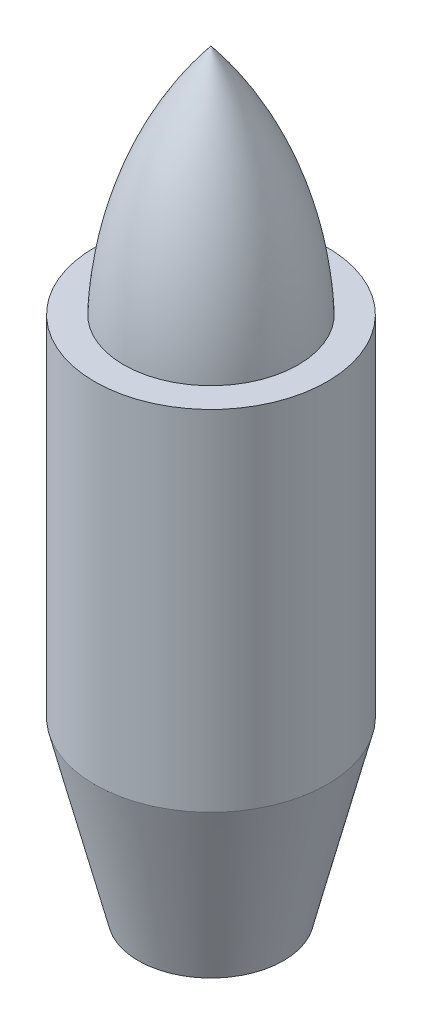
ISO-10303-21;
HEADER;
FILE_DESCRIPTION(('STEP AP214'),'2;1');
FILE_NAME('part.step','',(''),(''),'','','');
FILE_SCHEMA(('AUTOMOTIVE_DESIGN { 1 0 10303 214 1 1 1 1 }'));
ENDSEC;
DATA;
#1=APPLICATION_CONTEXT('core data for automotive mechanical design processes');
#2=APPLICATION_PROTOCOL_DEFINITION('international standard','automotive_design',2000,#1);
#3=PRODUCT_CONTEXT('',#1,'mechanical');
#4=PRODUCT('Part','Part','',(#3));
#5=PRODUCT_RELATED_PRODUCT_CATEGORY('part','',(#4));
#6=PRODUCT_DEFINITION_FORMATION('','',#4);
#7=PRODUCT_DEFINITION_CONTEXT('part definition',#1,'design');
#8=PRODUCT_DEFINITION('design','',#6,#7);
#9=PRODUCT_DEFINITION_SHAPE('','',#8);
#10=(LENGTH_UNIT() NAMED_UNIT(*) SI_UNIT(.MILLI.,.METRE.));
#11=(NAMED_UNIT(*) PLANE_ANGLE_UNIT() SI_UNIT($,.RADIAN.));
#12=(NAMED_UNIT(*) SI_UNIT($,.STERADIAN.) SOLID_ANGLE_UNIT());
#13=UNCERTAINTY_MEASURE_WITH_UNIT(LENGTH_MEASURE(1.E-05),#10,'distance_accuracy_value','');
#14=(GEOMETRIC_REPRESENTATION_CONTEXT(3) GLOBAL_UNCERTAINTY_ASSIGNED_CONTEXT((#13)) GLOBAL_UNIT_ASSIGNED_CONTEXT((#10,
#11,#12)) REPRESENTATION_CONTEXT('',''));
#15=CARTESIAN_POINT('',(0.,0.,0.));
#16=DIRECTION('',(0.,0.,1.));
#17=DIRECTION('',(1.,0.,0.));
#18=AXIS2_PLACEMENT_3D('',#15,#16,#17);
#19=CARTESIAN_POINT('',(0.,600.,0.));
#20=DIRECTION('',(0.,-1.,0.));
#21=DIRECTION('',(0.,0.,-1.));
#22=AXIS2_PLACEMENT_3D('',#19,#20,#21);
#23=CYLINDRICAL_SURFACE('',#22,200.);
#24=CARTESIAN_POINT('',(0.,600.,0.));
#25=DIRECTION('',(0.,1.,0.));
#26=DIRECTION('',(0.,0.,1.));
#27=AXIS2_PLACEMENT_3D('',#24,#25,#26);
#28=CIRCLE('',#27,200.);
#29=CARTESIAN_POINT('',(0.,600.,200.));
#30=VERTEX_POINT('',#29);
#31=EDGE_CURVE('E167',#30,#30,#28,.T.);
#32=ORIENTED_EDGE('',*,*,#31,.F.);
#33=EDGE_LOOP('',(#32));
#34=FACE_BOUND('',#33,.T.);
#35=CARTESIAN_POINT('',(0.,0.,0.));
#36=DIRECTION('',(0.,1.,0.));
#37=DIRECTION('',(0.,0.,1.));
#38=AXIS2_PLACEMENT_3D('',#35,#36,#37);
#39=CIRCLE('',#38,200.);
#40=CARTESIAN_POINT('',(0.,0.,200.));
#41=VERTEX_POINT('',#40);
#42=EDGE_CURVE('E80',#41,#41,#39,.F.);
#43=ORIENTED_EDGE('',*,*,#42,.F.);
#44=EDGE_LOOP('',(#43));
#45=FACE_BOUND('',#44,.T.);
#46=ADVANCED_FACE('F44',(#34,#45),#23,.T.);
#47=CARTESIAN_POINT('',(0.,600.,0.));
#48=DIRECTION('',(0.,1.,0.));
#49=DIRECTION('',(0.,0.,1.));
#50=AXIS2_PLACEMENT_3D('',#47,#48,#49);
#51=PLANE('',#50);
#52=CARTESIAN_POINT('',(0.,600.,0.));
#53=DIRECTION('',(0.,1.,0.));
#54=DIRECTION('',(0.,0.,1.));
#55=AXIS2_PLACEMENT_3D('',#52,#53,#54);
#56=CIRCLE('',#55,150.);
#57=CARTESIAN_POINT('',(0.,600.,150.));
#58=VERTEX_POINT('',#57);
#59=EDGE_CURVE('E62',#58,#58,#56,.T.);
#60=ORIENTED_EDGE('',*,*,#59,.F.);
#61=EDGE_LOOP('',(#60));
#62=FACE_BOUND('',#61,.T.);
#63=ORIENTED_EDGE('',*,*,#31,.T.);
#64=EDGE_LOOP('',(#63));
#65=FACE_BOUND('',#64,.T.);
#66=ADVANCED_FACE('F93',(#62,#65),#51,.T.);
#67=CARTESIAN_POINT('',(0.,-300.,0.));
#68=DIRECTION('',(0.,-1.,0.));
#69=DIRECTION('',(0.,0.,-1.));
#70=AXIS2_PLACEMENT_3D('',#67,#68,#69);
#71=PLANE('',#70);
#72=CARTESIAN_POINT('',(0.,-300.,0.));
#73=DIRECTION('',(0.,-1.,0.));
#74=DIRECTION('',(0.,0.,-1.));
#75=AXIS2_PLACEMENT_3D('',#72,#73,#74);
#76=CIRCLE('',#75,125.);
#77=CARTESIAN_POINT('',(0.,-300.,-125.));
#78=VERTEX_POINT('',#77);
#79=EDGE_CURVE('E69',#78,#78,#76,.T.);
#80=ORIENTED_EDGE('',*,*,#79,.T.);
#81=EDGE_LOOP('',(#80));
#82=FACE_BOUND('',#81,.T.);
#83=ADVANCED_FACE('F90',(#82),#71,.T.);
#84=CARTESIAN_POINT('',(0.,-300.,0.));
#85=DIRECTION('',(0.,1.,0.));
#86=DIRECTION('',(0.,0.,1.));
#87=AXIS2_PLACEMENT_3D('',#84,#85,#86);
#88=CONICAL_SURFACE('',#87,125.,0.244978663126864);
#89=ORIENTED_EDGE('',*,*,#79,.F.);
#90=EDGE_LOOP('',(#89));
#91=FACE_BOUND('',#90,.T.);
#92=ORIENTED_EDGE('',*,*,#42,.T.);
#93=EDGE_LOOP('',(#92));
#94=FACE_BOUND('',#93,.T.);
#95=ADVANCED_FACE('F58',(#91,#94),#88,.T.);
#96=CARTESIAN_POINT('',(0.,573.95599894941,-527.784002801573));
#97=DIRECTION('',(-1.,0.,0.));
#98=DIRECTION('',(0.,0.,1.));
#99=AXIS2_PLACEMENT_3D('',#96,#97,#98);
#100=CIRCLE('',#99,678.284191504156);
#101=TRIMMED_CURVE('',#100,(PARAMETER_VALUE(-0.679135012983858)),
(PARAMETER_VALUE(0.679135012983858)),.T.,.PARAMETER.);
#102=CARTESIAN_POINT('',(0.,573.95599894941,0.));
#103=DIRECTION('',(0.,1.,0.));
#104=AXIS1_PLACEMENT('',#102,#103);
#105=SURFACE_OF_REVOLUTION('',#101,#104);
#106=CARTESIAN_POINT('',(0.,1000.,0.));
#107=VERTEX_POINT('',#106);
#108=VERTEX_LOOP('',#107);
#109=FACE_BOUND('',#108,.T.);
#110=ORIENTED_EDGE('',*,*,#59,.T.);
#111=EDGE_LOOP('',(#110));
#112=FACE_BOUND('',#111,.T.);
#113=ADVANCED_FACE('F55',(#109,#112),#105,.T.);
#114=CLOSED_SHELL('',(#46,#66,#83,#95,#113));
#115=CARTESIAN_POINT('',(0.,1000.,0.));
#116=DIRECTION('',(0.,1.,0.));
#117=DIRECTION('',(0.,0.,1.));
#118=AXIS2_PLACEMENT_3D('',#115,#116,#117);
#119=CYLINDRICAL_SURFACE('',#118,10.);
#120=CARTESIAN_POINT('',(0.,600.,0.));
#121=DIRECTION('',(0.,1.,0.));
#122=DIRECTION('',(0.,0.,1.));
#123=AXIS2_PLACEMENT_3D('',#120,#121,#122);
#124=CIRCLE('',#123,10.);
#125=CARTESIAN_POINT('',(0.,600.,10.));
#126=VERTEX_POINT('',#125);
#127=EDGE_CURVE('E12',#126,#126,#124,.T.);
#128=ORIENTED_EDGE('',*,*,#127,.T.);
#129=EDGE_LOOP('',(#128));
#130=FACE_BOUND('',#129,.T.);
#131=CARTESIAN_POINT('',(0.,970.682765055606,0.));
#132=DIRECTION('',(0.,1.,0.));
#133=DIRECTION('',(0.,0.,1.));
#134=AXIS2_PLACEMENT_3D('',#131,#132,#133);
#135=CIRCLE('',#134,10.);
#136=CARTESIAN_POINT('',(0.,970.682765055606,10.));
#137=VERTEX_POINT('',#136);
#138=EDGE_CURVE('E65',#137,#137,#135,.T.);
#139=ORIENTED_EDGE('',*,*,#138,.F.);
#140=EDGE_LOOP('',(#139));
#141=FACE_BOUND('',#140,.T.);
#142=ADVANCED_FACE('F110',(#130,#141),#119,.T.);
#143=CARTESIAN_POINT('',(0.,573.95599894941,0.));
#144=DIRECTION('',(0.,1.,0.));
#145=DIRECTION('',(0.,0.,1.));
#146=AXIS2_PLACEMENT_3D('',#143,#144,#145);
#147=DEGENERATE_TOROIDAL_SURFACE('',#146,527.784002801573,668.284191504156,.F.);
#148=CARTESIAN_POINT('',(0.,600.,0.));
#149=DIRECTION('',(0.,1.,0.));
#150=DIRECTION('',(0.,0.,1.));
#151=AXIS2_PLACEMENT_3D('',#148,#149,#150);
#152=CIRCLE('',#151,139.992509681188);
#153=CARTESIAN_POINT('',(0.,600.,139.992509681188));
#154=VERTEX_POINT('',#153);
#155=EDGE_CURVE('E52',#154,#154,#152,.F.);
#156=ORIENTED_EDGE('',*,*,#155,.T.);
#157=EDGE_LOOP('',(#156));
#158=FACE_BOUND('',#157,.T.);
#159=ORIENTED_EDGE('',*,*,#138,.T.);
#160=EDGE_LOOP('',(#159));
#161=FACE_BOUND('',#160,.T.);
#162=ADVANCED_FACE('F104',(#158,#161),#147,.T.);
#163=ORIENTED_EDGE('',*,*,#155,.F.);
#164=EDGE_LOOP('',(#163));
#165=FACE_BOUND('',#164,.T.);
#166=ORIENTED_EDGE('',*,*,#127,.F.);
#167=EDGE_LOOP('',(#166));
#168=FACE_BOUND('',#167,.T.);
#169=ADVANCED_FACE('F95',(#165,#168),#51,.T.);
#170=CLOSED_SHELL('',(#142,#162,#169));
#171=ORIENTED_CLOSED_SHELL('',*,#170,.T.);
#172=BREP_WITH_VOIDS('B2',#114,(#171));
#173=ADVANCED_BREP_SHAPE_REPRESENTATION('',(#18,#172),#14);
#174=SHAPE_DEFINITION_REPRESENTATION(#9,#173);
ENDSEC;
END-ISO-10303-21;
